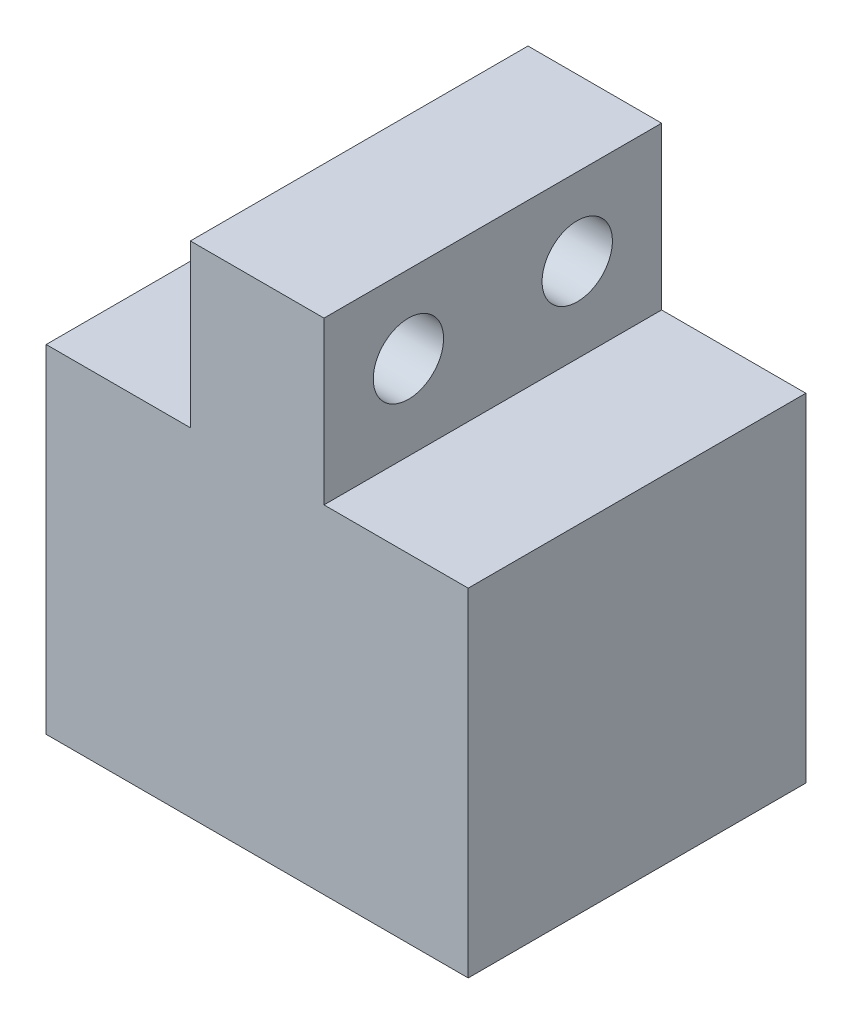
ISO-10303-21;
HEADER;
FILE_DESCRIPTION(('STEP AP214'),'2;1');
FILE_NAME('part.step','',(''),(''),'','','');
FILE_SCHEMA(('AUTOMOTIVE_DESIGN { 1 0 10303 214 1 1 1 1 }'));
ENDSEC;
DATA;
#1=APPLICATION_CONTEXT('core data for automotive mechanical design processes');
#2=APPLICATION_PROTOCOL_DEFINITION('international standard','automotive_design',2000,#1);
#3=PRODUCT_CONTEXT('',#1,'mechanical');
#4=PRODUCT('Part','Part','',(#3));
#5=PRODUCT_RELATED_PRODUCT_CATEGORY('part','',(#4));
#6=PRODUCT_DEFINITION_FORMATION('','',#4);
#7=PRODUCT_DEFINITION_CONTEXT('part definition',#1,'design');
#8=PRODUCT_DEFINITION('design','',#6,#7);
#9=PRODUCT_DEFINITION_SHAPE('','',#8);
#10=(LENGTH_UNIT() NAMED_UNIT(*) SI_UNIT(.MILLI.,.METRE.));
#11=(NAMED_UNIT(*) PLANE_ANGLE_UNIT() SI_UNIT($,.RADIAN.));
#12=(NAMED_UNIT(*) SI_UNIT($,.STERADIAN.) SOLID_ANGLE_UNIT());
#13=UNCERTAINTY_MEASURE_WITH_UNIT(LENGTH_MEASURE(1.E-05),#10,'distance_accuracy_value','');
#14=(GEOMETRIC_REPRESENTATION_CONTEXT(3) GLOBAL_UNCERTAINTY_ASSIGNED_CONTEXT((#13)) GLOBAL_UNIT_ASSIGNED_CONTEXT((#10,
#11,#12)) REPRESENTATION_CONTEXT('',''));
#15=CARTESIAN_POINT('',(0.,0.,0.));
#16=DIRECTION('',(0.,0.,1.));
#17=DIRECTION('',(1.,0.,0.));
#18=AXIS2_PLACEMENT_3D('',#15,#16,#17);
#19=CARTESIAN_POINT('',(5.125,0.,12.));
#20=DIRECTION('',(-1.,0.,0.));
#21=DIRECTION('',(0.,0.,1.));
#22=AXIS2_PLACEMENT_3D('',#19,#20,#21);
#23=PLANE('',#22);
#24=CARTESIAN_POINT('',(5.125,15.,3.));
#25=DIRECTION('',(-1.,0.,0.));
#26=DIRECTION('',(0.,0.,1.));
#27=AXIS2_PLACEMENT_3D('',#24,#25,#26);
#28=CIRCLE('',#27,1.25);
#29=CARTESIAN_POINT('',(5.125,15.,4.25));
#30=VERTEX_POINT('',#29);
#31=EDGE_CURVE('E164',#30,#30,#28,.T.);
#32=ORIENTED_EDGE('',*,*,#31,.F.);
#33=EDGE_LOOP('',(#32));
#34=FACE_BOUND('',#33,.T.);
#35=CARTESIAN_POINT('',(5.125,15.,9.));
#36=DIRECTION('',(-1.,0.,0.));
#37=DIRECTION('',(0.,0.,1.));
#38=AXIS2_PLACEMENT_3D('',#35,#36,#37);
#39=CIRCLE('',#38,1.25);
#40=CARTESIAN_POINT('',(5.125,15.,10.25));
#41=VERTEX_POINT('',#40);
#42=EDGE_CURVE('E160',#41,#41,#39,.T.);
#43=ORIENTED_EDGE('',*,*,#42,.F.);
#44=EDGE_LOOP('',(#43));
#45=FACE_BOUND('',#44,.T.);
#46=DIRECTION('',(0.,1.,0.));
#47=VECTOR('',#46,1.);
#48=CARTESIAN_POINT('',(5.125,0.,0.));
#49=LINE('',#48,#47);
#50=CARTESIAN_POINT('',(5.125,12.,0.));
#51=VERTEX_POINT('',#50);
#52=CARTESIAN_POINT('',(5.125,17.75,0.));
#53=VERTEX_POINT('',#52);
#54=EDGE_CURVE('E176',#51,#53,#49,.T.);
#55=ORIENTED_EDGE('',*,*,#54,.F.);
#56=DIRECTION('',(0.,0.,-1.));
#57=VECTOR('',#56,1.);
#58=CARTESIAN_POINT('',(5.125,12.,12.));
#59=LINE('',#58,#57);
#60=CARTESIAN_POINT('',(5.125,12.,12.));
#61=VERTEX_POINT('',#60);
#62=EDGE_CURVE('E11',#61,#51,#59,.T.);
#63=ORIENTED_EDGE('',*,*,#62,.F.);
#64=DIRECTION('',(0.,1.,0.));
#65=VECTOR('',#64,1.);
#66=CARTESIAN_POINT('',(5.125,0.,12.));
#67=LINE('',#66,#65);
#68=CARTESIAN_POINT('',(5.125,17.75,12.));
#69=VERTEX_POINT('',#68);
#70=EDGE_CURVE('E148',#61,#69,#67,.T.);
#71=ORIENTED_EDGE('',*,*,#70,.T.);
#72=DIRECTION('',(0.,0.,-1.));
#73=VECTOR('',#72,1.);
#74=CARTESIAN_POINT('',(5.125,17.75,12.));
#75=LINE('',#74,#73);
#76=EDGE_CURVE('E63',#69,#53,#75,.T.);
#77=ORIENTED_EDGE('',*,*,#76,.T.);
#78=EDGE_LOOP('',(#55,#63,#71,#77));
#79=FACE_BOUND('',#78,.T.);
#80=ADVANCED_FACE('F44',(#34,#45,#79),#23,.T.);
#81=CARTESIAN_POINT('',(0.,12.,12.));
#82=DIRECTION('',(0.,1.,0.));
#83=DIRECTION('',(0.,0.,1.));
#84=AXIS2_PLACEMENT_3D('',#81,#82,#83);
#85=PLANE('',#84);
#86=DIRECTION('',(1.,0.,0.));
#87=VECTOR('',#86,1.);
#88=CARTESIAN_POINT('',(0.,12.,0.));
#89=LINE('',#88,#87);
#90=CARTESIAN_POINT('',(0.,12.,0.));
#91=VERTEX_POINT('',#90);
#92=EDGE_CURVE('E206',#91,#51,#89,.T.);
#93=ORIENTED_EDGE('',*,*,#92,.F.);
#94=DIRECTION('',(0.,0.,-1.));
#95=VECTOR('',#94,1.);
#96=CARTESIAN_POINT('',(0.,12.,12.));
#97=LINE('',#96,#95);
#98=CARTESIAN_POINT('',(0.,12.,12.));
#99=VERTEX_POINT('',#98);
#100=EDGE_CURVE('E54',#99,#91,#97,.T.);
#101=ORIENTED_EDGE('',*,*,#100,.F.);
#102=DIRECTION('',(1.,0.,0.));
#103=VECTOR('',#102,1.);
#104=CARTESIAN_POINT('',(0.,12.,12.));
#105=LINE('',#104,#103);
#106=EDGE_CURVE('E139',#99,#61,#105,.T.);
#107=ORIENTED_EDGE('',*,*,#106,.T.);
#108=ORIENTED_EDGE('',*,*,#62,.T.);
#109=EDGE_LOOP('',(#93,#101,#107,#108));
#110=FACE_BOUND('',#109,.T.);
#111=ADVANCED_FACE('F239',(#110),#85,.T.);
#112=CARTESIAN_POINT('',(0.,0.,12.));
#113=DIRECTION('',(-1.,0.,0.));
#114=DIRECTION('',(0.,0.,1.));
#115=AXIS2_PLACEMENT_3D('',#112,#113,#114);
#116=PLANE('',#115);
#117=DIRECTION('',(0.,1.,0.));
#118=VECTOR('',#117,1.);
#119=CARTESIAN_POINT('',(0.,0.,0.));
#120=LINE('',#119,#118);
#121=CARTESIAN_POINT('',(0.,0.,0.));
#122=VERTEX_POINT('',#121);
#123=EDGE_CURVE('E202',#122,#91,#120,.T.);
#124=ORIENTED_EDGE('',*,*,#123,.F.);
#125=DIRECTION('',(0.,0.,-1.));
#126=VECTOR('',#125,1.);
#127=CARTESIAN_POINT('',(0.,0.,12.));
#128=LINE('',#127,#126);
#129=CARTESIAN_POINT('',(0.,0.,12.));
#130=VERTEX_POINT('',#129);
#131=EDGE_CURVE('E180',#130,#122,#128,.T.);
#132=ORIENTED_EDGE('',*,*,#131,.F.);
#133=DIRECTION('',(0.,1.,0.));
#134=VECTOR('',#133,1.);
#135=CARTESIAN_POINT('',(0.,0.,12.));
#136=LINE('',#135,#134);
#137=EDGE_CURVE('E147',#130,#99,#136,.T.);
#138=ORIENTED_EDGE('',*,*,#137,.T.);
#139=ORIENTED_EDGE('',*,*,#100,.T.);
#140=EDGE_LOOP('',(#124,#132,#138,#139));
#141=FACE_BOUND('',#140,.T.);
#142=ADVANCED_FACE('F244',(#141),#116,.T.);
#143=CARTESIAN_POINT('',(0.,0.,12.));
#144=DIRECTION('',(0.,1.,0.));
#145=DIRECTION('',(0.,0.,1.));
#146=AXIS2_PLACEMENT_3D('',#143,#144,#145);
#147=PLANE('',#146);
#148=DIRECTION('',(1.,0.,0.));
#149=VECTOR('',#148,1.);
#150=CARTESIAN_POINT('',(0.,0.,0.));
#151=LINE('',#150,#149);
#152=CARTESIAN_POINT('',(15.,0.,0.));
#153=VERTEX_POINT('',#152);
#154=EDGE_CURVE('E199',#122,#153,#151,.T.);
#155=ORIENTED_EDGE('',*,*,#154,.T.);
#156=DIRECTION('',(0.,0.,-1.));
#157=VECTOR('',#156,1.);
#158=CARTESIAN_POINT('',(15.,0.,12.));
#159=LINE('',#158,#157);
#160=CARTESIAN_POINT('',(15.,0.,12.));
#161=VERTEX_POINT('',#160);
#162=EDGE_CURVE('E183',#161,#153,#159,.T.);
#163=ORIENTED_EDGE('',*,*,#162,.F.);
#164=DIRECTION('',(1.,0.,0.));
#165=VECTOR('',#164,1.);
#166=CARTESIAN_POINT('',(0.,0.,12.));
#167=LINE('',#166,#165);
#168=EDGE_CURVE('E141',#130,#161,#167,.T.);
#169=ORIENTED_EDGE('',*,*,#168,.F.);
#170=ORIENTED_EDGE('',*,*,#131,.T.);
#171=EDGE_LOOP('',(#155,#163,#169,#170));
#172=FACE_BOUND('',#171,.T.);
#173=ADVANCED_FACE('F219',(#172),#147,.F.);
#174=CARTESIAN_POINT('',(15.,0.,12.));
#175=DIRECTION('',(-1.,0.,0.));
#176=DIRECTION('',(0.,0.,1.));
#177=AXIS2_PLACEMENT_3D('',#174,#175,#176);
#178=PLANE('',#177);
#179=DIRECTION('',(0.,1.,0.));
#180=VECTOR('',#179,1.);
#181=CARTESIAN_POINT('',(15.,0.,0.));
#182=LINE('',#181,#180);
#183=CARTESIAN_POINT('',(15.,12.,0.));
#184=VERTEX_POINT('',#183);
#185=EDGE_CURVE('E195',#153,#184,#182,.T.);
#186=ORIENTED_EDGE('',*,*,#185,.T.);
#187=DIRECTION('',(0.,0.,-1.));
#188=VECTOR('',#187,1.);
#189=CARTESIAN_POINT('',(15.,12.,12.));
#190=LINE('',#189,#188);
#191=CARTESIAN_POINT('',(15.,12.,12.));
#192=VERTEX_POINT('',#191);
#193=EDGE_CURVE('E124',#192,#184,#190,.T.);
#194=ORIENTED_EDGE('',*,*,#193,.F.);
#195=DIRECTION('',(0.,1.,0.));
#196=VECTOR('',#195,1.);
#197=CARTESIAN_POINT('',(15.,0.,12.));
#198=LINE('',#197,#196);
#199=EDGE_CURVE('E135',#161,#192,#198,.T.);
#200=ORIENTED_EDGE('',*,*,#199,.F.);
#201=ORIENTED_EDGE('',*,*,#162,.T.);
#202=EDGE_LOOP('',(#186,#194,#200,#201));
#203=FACE_BOUND('',#202,.T.);
#204=ADVANCED_FACE('F223',(#203),#178,.F.);
#205=CARTESIAN_POINT('',(9.875,12.,0.));
#206=VERTEX_POINT('',#205);
#207=EDGE_CURVE('E120',#206,#184,#89,.T.);
#208=ORIENTED_EDGE('',*,*,#207,.F.);
#209=DIRECTION('',(0.,0.,-1.));
#210=VECTOR('',#209,1.);
#211=CARTESIAN_POINT('',(9.875,12.,12.));
#212=LINE('',#211,#210);
#213=CARTESIAN_POINT('',(9.875,12.,12.));
#214=VERTEX_POINT('',#213);
#215=EDGE_CURVE('E114',#214,#206,#212,.T.);
#216=ORIENTED_EDGE('',*,*,#215,.F.);
#217=EDGE_CURVE('E118',#214,#192,#105,.T.);
#218=ORIENTED_EDGE('',*,*,#217,.T.);
#219=ORIENTED_EDGE('',*,*,#193,.T.);
#220=EDGE_LOOP('',(#208,#216,#218,#219));
#221=FACE_BOUND('',#220,.T.);
#222=ADVANCED_FACE('F116',(#221),#85,.T.);
#223=CARTESIAN_POINT('',(9.875,0.,12.));
#224=DIRECTION('',(-1.,0.,0.));
#225=DIRECTION('',(0.,0.,1.));
#226=AXIS2_PLACEMENT_3D('',#223,#224,#225);
#227=PLANE('',#226);
#228=CARTESIAN_POINT('',(9.875,15.,3.));
#229=DIRECTION('',(-1.,0.,0.));
#230=DIRECTION('',(0.,0.,1.));
#231=AXIS2_PLACEMENT_3D('',#228,#229,#230);
#232=CIRCLE('',#231,1.25);
#233=CARTESIAN_POINT('',(9.875,15.,4.25));
#234=VERTEX_POINT('',#233);
#235=EDGE_CURVE('E47',#234,#234,#232,.T.);
#236=ORIENTED_EDGE('',*,*,#235,.T.);
#237=EDGE_LOOP('',(#236));
#238=FACE_BOUND('',#237,.T.);
#239=CARTESIAN_POINT('',(9.875,15.,9.));
#240=DIRECTION('',(-1.,0.,0.));
#241=DIRECTION('',(0.,0.,1.));
#242=AXIS2_PLACEMENT_3D('',#239,#240,#241);
#243=CIRCLE('',#242,1.25);
#244=CARTESIAN_POINT('',(9.875,15.,10.25));
#245=VERTEX_POINT('',#244);
#246=EDGE_CURVE('E167',#245,#245,#243,.T.);
#247=ORIENTED_EDGE('',*,*,#246,.T.);
#248=EDGE_LOOP('',(#247));
#249=FACE_BOUND('',#248,.T.);
#250=DIRECTION('',(0.,1.,0.));
#251=VECTOR('',#250,1.);
#252=CARTESIAN_POINT('',(9.875,0.,0.));
#253=LINE('',#252,#251);
#254=CARTESIAN_POINT('',(9.875,17.75,0.));
#255=VERTEX_POINT('',#254);
#256=EDGE_CURVE('E157',#206,#255,#253,.T.);
#257=ORIENTED_EDGE('',*,*,#256,.T.);
#258=DIRECTION('',(0.,0.,-1.));
#259=VECTOR('',#258,1.);
#260=CARTESIAN_POINT('',(9.875,17.75,12.));
#261=LINE('',#260,#259);
#262=CARTESIAN_POINT('',(9.875,17.75,12.));
#263=VERTEX_POINT('',#262);
#264=EDGE_CURVE('E89',#263,#255,#261,.T.);
#265=ORIENTED_EDGE('',*,*,#264,.F.);
#266=DIRECTION('',(0.,1.,0.));
#267=VECTOR('',#266,1.);
#268=CARTESIAN_POINT('',(9.875,0.,12.));
#269=LINE('',#268,#267);
#270=EDGE_CURVE('E126',#214,#263,#269,.T.);
#271=ORIENTED_EDGE('',*,*,#270,.F.);
#272=ORIENTED_EDGE('',*,*,#215,.T.);
#273=EDGE_LOOP('',(#257,#265,#271,#272));
#274=FACE_BOUND('',#273,.T.);
#275=ADVANCED_FACE('F127',(#238,#249,#274),#227,.F.);
#276=CARTESIAN_POINT('',(0.,17.75,12.));
#277=DIRECTION('',(0.,1.,0.));
#278=DIRECTION('',(0.,0.,1.));
#279=AXIS2_PLACEMENT_3D('',#276,#277,#278);
#280=PLANE('',#279);
#281=DIRECTION('',(1.,0.,0.));
#282=VECTOR('',#281,1.);
#283=CARTESIAN_POINT('',(0.,17.75,0.));
#284=LINE('',#283,#282);
#285=EDGE_CURVE('E154',#53,#255,#284,.T.);
#286=ORIENTED_EDGE('',*,*,#285,.F.);
#287=ORIENTED_EDGE('',*,*,#76,.F.);
#288=DIRECTION('',(1.,0.,0.));
#289=VECTOR('',#288,1.);
#290=CARTESIAN_POINT('',(0.,17.75,12.));
#291=LINE('',#290,#289);
#292=EDGE_CURVE('E131',#69,#263,#291,.T.);
#293=ORIENTED_EDGE('',*,*,#292,.T.);
#294=ORIENTED_EDGE('',*,*,#264,.T.);
#295=EDGE_LOOP('',(#286,#287,#293,#294));
#296=FACE_BOUND('',#295,.T.);
#297=ADVANCED_FACE('F227',(#296),#280,.T.);
#298=CARTESIAN_POINT('',(0.,0.,12.));
#299=DIRECTION('',(0.,0.,1.));
#300=DIRECTION('',(1.,0.,0.));
#301=AXIS2_PLACEMENT_3D('',#298,#299,#300);
#302=PLANE('',#301);
#303=ORIENTED_EDGE('',*,*,#70,.F.);
#304=ORIENTED_EDGE('',*,*,#106,.F.);
#305=ORIENTED_EDGE('',*,*,#137,.F.);
#306=ORIENTED_EDGE('',*,*,#168,.T.);
#307=ORIENTED_EDGE('',*,*,#199,.T.);
#308=ORIENTED_EDGE('',*,*,#217,.F.);
#309=ORIENTED_EDGE('',*,*,#270,.T.);
#310=ORIENTED_EDGE('',*,*,#292,.F.);
#311=EDGE_LOOP('',(#303,#304,#305,#306,#307,#308,#309,#310));
#312=FACE_BOUND('',#311,.T.);
#313=ADVANCED_FACE('F133',(#312),#302,.T.);
#314=CARTESIAN_POINT('',(0.,0.,0.));
#315=DIRECTION('',(0.,0.,1.));
#316=DIRECTION('',(1.,0.,0.));
#317=AXIS2_PLACEMENT_3D('',#314,#315,#316);
#318=PLANE('',#317);
#319=ORIENTED_EDGE('',*,*,#54,.T.);
#320=ORIENTED_EDGE('',*,*,#285,.T.);
#321=ORIENTED_EDGE('',*,*,#256,.F.);
#322=ORIENTED_EDGE('',*,*,#207,.T.);
#323=ORIENTED_EDGE('',*,*,#185,.F.);
#324=ORIENTED_EDGE('',*,*,#154,.F.);
#325=ORIENTED_EDGE('',*,*,#123,.T.);
#326=ORIENTED_EDGE('',*,*,#92,.T.);
#327=EDGE_LOOP('',(#319,#320,#321,#322,#323,#324,#325,#326));
#328=FACE_BOUND('',#327,.T.);
#329=ADVANCED_FACE('F225',(#328),#318,.F.);
#330=CARTESIAN_POINT('',(15.125,15.,9.));
#331=DIRECTION('',(-1.,0.,0.));
#332=DIRECTION('',(0.,0.,1.));
#333=AXIS2_PLACEMENT_3D('',#330,#331,#332);
#334=CYLINDRICAL_SURFACE('',#333,1.25);
#335=ORIENTED_EDGE('',*,*,#42,.T.);
#336=EDGE_LOOP('',(#335));
#337=FACE_BOUND('',#336,.T.);
#338=ORIENTED_EDGE('',*,*,#246,.F.);
#339=EDGE_LOOP('',(#338));
#340=FACE_BOUND('',#339,.T.);
#341=ADVANCED_FACE('F277',(#337,#340),#334,.F.);
#342=CARTESIAN_POINT('',(15.125,15.,3.));
#343=DIRECTION('',(-1.,0.,0.));
#344=DIRECTION('',(0.,0.,1.));
#345=AXIS2_PLACEMENT_3D('',#342,#343,#344);
#346=CYLINDRICAL_SURFACE('',#345,1.25);
#347=ORIENTED_EDGE('',*,*,#31,.T.);
#348=EDGE_LOOP('',(#347));
#349=FACE_BOUND('',#348,.T.);
#350=ORIENTED_EDGE('',*,*,#235,.F.);
#351=EDGE_LOOP('',(#350));
#352=FACE_BOUND('',#351,.T.);
#353=ADVANCED_FACE('F282',(#349,#352),#346,.F.);
#354=CLOSED_SHELL('',(#80,#111,#142,#173,#204,#222,#275,#297,#313,#329,#341,#353));
#355=MANIFOLD_SOLID_BREP('B2',#354);
#356=ADVANCED_BREP_SHAPE_REPRESENTATION('',(#18,#355),#14);
#357=SHAPE_DEFINITION_REPRESENTATION(#9,#356);
ENDSEC;
END-ISO-10303-21;
